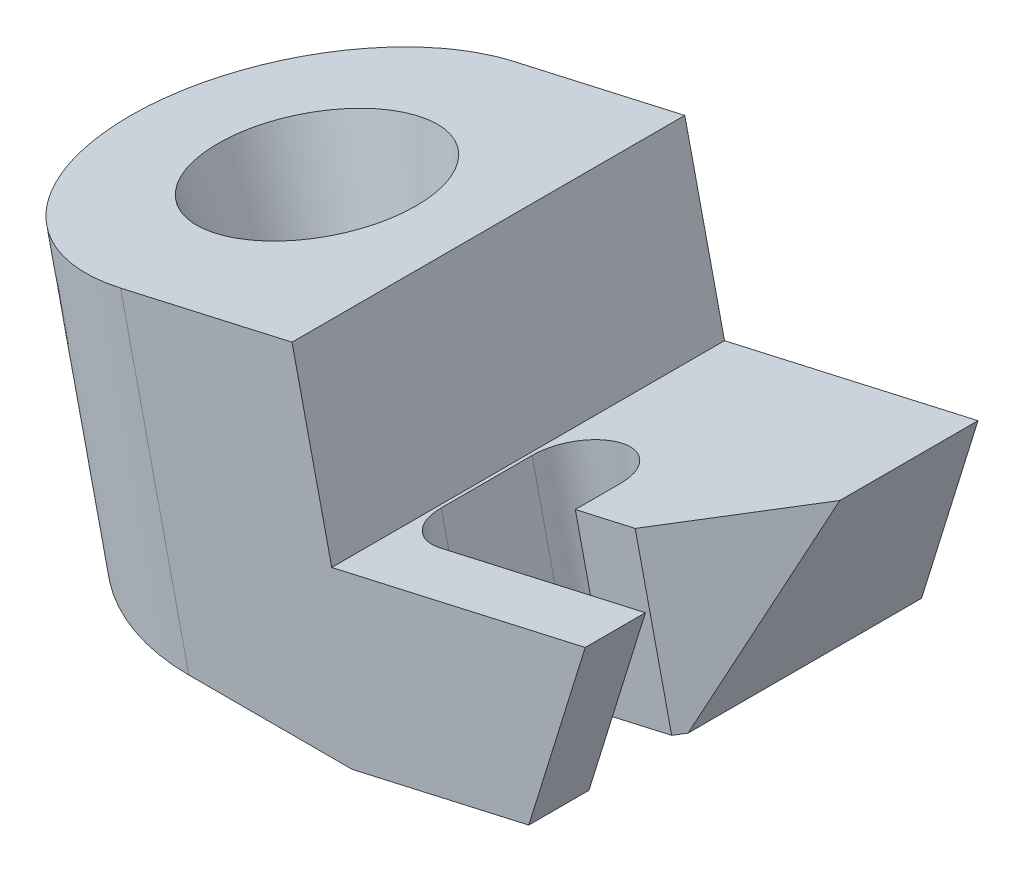
ISO-10303-21;
HEADER;
FILE_DESCRIPTION(('STEP AP214'),'2;1');
FILE_NAME('part.step','',(''),(''),'','','');
FILE_SCHEMA(('AUTOMOTIVE_DESIGN { 1 0 10303 214 1 1 1 1 }'));
ENDSEC;
DATA;
#1=APPLICATION_CONTEXT('core data for automotive mechanical design processes');
#2=APPLICATION_PROTOCOL_DEFINITION('international standard','automotive_design',2000,#1);
#3=PRODUCT_CONTEXT('',#1,'mechanical');
#4=PRODUCT('Part','Part','',(#3));
#5=PRODUCT_RELATED_PRODUCT_CATEGORY('part','',(#4));
#6=PRODUCT_DEFINITION_FORMATION('','',#4);
#7=PRODUCT_DEFINITION_CONTEXT('part definition',#1,'design');
#8=PRODUCT_DEFINITION('design','',#6,#7);
#9=PRODUCT_DEFINITION_SHAPE('','',#8);
#10=(LENGTH_UNIT() NAMED_UNIT(*) SI_UNIT(.MILLI.,.METRE.));
#11=(NAMED_UNIT(*) PLANE_ANGLE_UNIT() SI_UNIT($,.RADIAN.));
#12=(NAMED_UNIT(*) SI_UNIT($,.STERADIAN.) SOLID_ANGLE_UNIT());
#13=UNCERTAINTY_MEASURE_WITH_UNIT(LENGTH_MEASURE(1.E-05),#10,'distance_accuracy_value','');
#14=(GEOMETRIC_REPRESENTATION_CONTEXT(3) GLOBAL_UNCERTAINTY_ASSIGNED_CONTEXT((#13)) GLOBAL_UNIT_ASSIGNED_CONTEXT((#10,
#11,#12)) REPRESENTATION_CONTEXT('',''));
#15=CARTESIAN_POINT('',(0.,0.,0.));
#16=DIRECTION('',(0.,0.,1.));
#17=DIRECTION('',(1.,0.,0.));
#18=AXIS2_PLACEMENT_3D('',#15,#16,#17);
#19=CARTESIAN_POINT('',(-0.484477364538291,2.13726133435911,4.));
#20=DIRECTION('',(-0.221072685576457,0.975257334087785,0.));
#21=DIRECTION('',(-0.975257334087785,-0.221072685576457,0.));
#22=AXIS2_PLACEMENT_3D('',#19,#20,#21);
#23=PLANE('',#22);
#24=DIRECTION('',(0.689611074335385,0.156321995106234,-0.70710678118655));
#25=VECTOR('',#24,1.);
#26=CARTESIAN_POINT('',(-4.35365931639325,1.26018980135637,0.0326553652898135));
#27=LINE('',#26,#25);
#28=CARTESIAN_POINT('',(-4.5900076987712,1.20661402212594,0.275000000000022));
#29=VERTEX_POINT('',#28);
#30=CARTESIAN_POINT('',(-3.97817974770208,1.3453040309328,-0.352350269189598));
#31=VERTEX_POINT('',#30);
#32=EDGE_CURVE('E326',#29,#31,#27,.T.);
#33=ORIENTED_EDGE('',*,*,#32,.T.);
#34=DIRECTION('',(0.,0.,-1.));
#35=VECTOR('',#34,1.);
#36=CARTESIAN_POINT('',(-3.97817974770208,1.34530403093281,4.));
#37=LINE('',#36,#35);
#38=CARTESIAN_POINT('',(-3.97817974770208,1.3453040309328,-1.18958797837479));
#39=VERTEX_POINT('',#38);
#40=EDGE_CURVE('E331',#31,#39,#37,.T.);
#41=ORIENTED_EDGE('',*,*,#40,.T.);
#42=DIRECTION('',(-0.975257334087785,-0.221072685576457,0.));
#43=VECTOR('',#42,1.);
#44=CARTESIAN_POINT('',(-6.55185639975374,0.761899436691352,-1.18958797837479));
#45=LINE('',#44,#43);
#46=CARTESIAN_POINT('',(-5.51363645217724,0.997244574848627,-1.18958797837479));
#47=VERTEX_POINT('',#46);
#48=EDGE_CURVE('E188',#39,#47,#45,.T.);
#49=ORIENTED_EDGE('',*,*,#48,.T.);
#50=DIRECTION('',(0.,0.,-1.));
#51=VECTOR('',#50,1.);
#52=CARTESIAN_POINT('',(-5.51363645217724,0.997244574848627,4.));
#53=LINE('',#52,#51);
#54=CARTESIAN_POINT('',(-5.51363645217724,0.997244574848627,1.18958797837479));
#55=VERTEX_POINT('',#54);
#56=EDGE_CURVE('E179',#55,#47,#53,.T.);
#57=ORIENTED_EDGE('',*,*,#56,.F.);
#58=DIRECTION('',(0.975257334087785,0.221072685576457,0.));
#59=VECTOR('',#58,1.);
#60=CARTESIAN_POINT('',(-3.95609043161414,1.35031126775064,1.18958797837479));
#61=LINE('',#60,#59);
#62=CARTESIAN_POINT('',(-3.97817974770208,1.3453040309328,1.18958797837479));
#63=VERTEX_POINT('',#62);
#64=EDGE_CURVE('E308',#55,#63,#61,.T.);
#65=ORIENTED_EDGE('',*,*,#64,.T.);
#66=DIRECTION('',(0.,0.,-1.));
#67=VECTOR('',#66,1.);
#68=CARTESIAN_POINT('',(-3.97817974770208,1.34530403093281,4.));
#69=LINE('',#68,#67);
#70=CARTESIAN_POINT('',(-3.97817974770208,1.3453040309328,0.82500000000007));
#71=VERTEX_POINT('',#70);
#72=EDGE_CURVE('E165',#63,#71,#69,.T.);
#73=ORIENTED_EDGE('',*,*,#72,.T.);
#74=DIRECTION('',(0.975257334087785,0.221072685576457,0.));
#75=VECTOR('',#74,1.);
#76=CARTESIAN_POINT('',(-0.484477364538291,2.13726133435911,0.82500000000007));
#77=LINE('',#76,#75);
#78=CARTESIAN_POINT('',(-5.22105925195091,1.06356638052156,0.82500000000007));
#79=VERTEX_POINT('',#78);
#80=EDGE_CURVE('E156',#79,#71,#77,.T.);
#81=ORIENTED_EDGE('',*,*,#80,.F.);
#82=CARTESIAN_POINT('',(-5.22105925195091,1.06356638052156,0.550000000000047));
#83=DIRECTION('',(-0.221072685576457,0.975257334087785,0.));
#84=DIRECTION('',(-0.975257334087785,-0.221072685576457,0.));
#85=AXIS2_PLACEMENT_3D('',#82,#83,#84);
#86=CIRCLE('',#85,0.275000000000024);
#87=CARTESIAN_POINT('',(-5.48925501882508,1.00277139198803,0.550000000000047));
#88=VERTEX_POINT('',#87);
#89=EDGE_CURVE('E146',#88,#79,#86,.T.);
#90=ORIENTED_EDGE('',*,*,#89,.F.);
#91=DIRECTION('',(0.,0.,1.));
#92=VECTOR('',#91,1.);
#93=CARTESIAN_POINT('',(-5.48925501882507,1.00277139198803,4.));
#94=LINE('',#93,#92);
#95=CARTESIAN_POINT('',(-5.48925501882508,1.00277139198803,0.));
#96=VERTEX_POINT('',#95);
#97=EDGE_CURVE('E177',#96,#88,#94,.T.);
#98=ORIENTED_EDGE('',*,*,#97,.F.);
#99=CARTESIAN_POINT('',(-5.22105925195091,1.06356638052156,0.));
#100=DIRECTION('',(-0.221072685576457,0.975257334087785,0.));
#101=DIRECTION('',(-0.975257334087785,-0.221072685576457,0.));
#102=AXIS2_PLACEMENT_3D('',#99,#100,#101);
#103=CIRCLE('',#102,0.275000000000024);
#104=CARTESIAN_POINT('',(-4.95286348507675,1.12436136905509,0.));
#105=VERTEX_POINT('',#104);
#106=EDGE_CURVE('E175',#105,#96,#103,.T.);
#107=ORIENTED_EDGE('',*,*,#106,.F.);
#108=DIRECTION('',(0.,0.,1.));
#109=VECTOR('',#108,1.);
#110=CARTESIAN_POINT('',(-4.95286348507675,1.12436136905509,4.));
#111=LINE('',#110,#109);
#112=CARTESIAN_POINT('',(-4.95286348507675,1.12436136905509,0.275000000000024));
#113=VERTEX_POINT('',#112);
#114=EDGE_CURVE('E169',#105,#113,#111,.T.);
#115=ORIENTED_EDGE('',*,*,#114,.T.);
#116=DIRECTION('',(0.975257334087785,0.221072685576457,0.));
#117=VECTOR('',#116,1.);
#118=CARTESIAN_POINT('',(-0.484477364538308,2.1372613343591,0.275000000000003));
#119=LINE('',#118,#117);
#120=EDGE_CURVE('E166',#113,#29,#119,.T.);
#121=ORIENTED_EDGE('',*,*,#120,.T.);
#122=EDGE_LOOP('',(#33,#41,#49,#57,#65,#73,#81,#90,#98,#107,#115,#121));
#123=FACE_BOUND('',#122,.T.);
#124=ADVANCED_FACE('F35',(#123),#23,.T.);
#125=CARTESIAN_POINT('',(-0.263404678961834,1.16200400027132,4.));
#126=DIRECTION('',(0.221072685576457,-0.975257334087785,0.));
#127=DIRECTION('',(0.975257334087785,0.221072685576457,0.));
#128=AXIS2_PLACEMENT_3D('',#125,#126,#127);
#129=PLANE('',#128);
#130=DIRECTION('',(0.975257334087785,0.221072685576457,0.));
#131=VECTOR('',#130,1.);
#132=CARTESIAN_POINT('',(-6.33078371417728,-0.213357897396431,-1.18958797837479));
#133=LINE('',#132,#131);
#134=CARTESIAN_POINT('',(-5.38956,0.,-1.18958797837479));
#135=VERTEX_POINT('',#134);
#136=CARTESIAN_POINT('',(-4.32017214649036,0.242410322316982,-1.18958797837479));
#137=VERTEX_POINT('',#136);
#138=EDGE_CURVE('E190',#135,#137,#133,.T.);
#139=ORIENTED_EDGE('',*,*,#138,.T.);
#140=DIRECTION('',(0.,0.,1.));
#141=VECTOR('',#140,1.);
#142=CARTESIAN_POINT('',(-4.32017214649036,0.24241032231698,-0.374999999999985));
#143=LINE('',#142,#141);
#144=CARTESIAN_POINT('',(-4.32017214649036,0.24241032231698,0.225000000000026));
#145=VERTEX_POINT('',#144);
#146=EDGE_CURVE('E337',#137,#145,#143,.T.);
#147=ORIENTED_EDGE('',*,*,#146,.T.);
#148=DIRECTION('',(-0.689611074335384,-0.156321995106234,0.70710678118655));
#149=VECTOR('',#148,1.);
#150=CARTESIAN_POINT('',(-4.13258663081679,0.284932467268589,0.0326553652898135));
#151=LINE('',#150,#149);
#152=CARTESIAN_POINT('',(-4.36893501319474,0.231356688038159,0.275000000000022));
#153=VERTEX_POINT('',#152);
#154=EDGE_CURVE('E328',#145,#153,#151,.T.);
#155=ORIENTED_EDGE('',*,*,#154,.T.);
#156=DIRECTION('',(-0.975257334087785,-0.221072685576457,0.));
#157=VECTOR('',#156,1.);
#158=CARTESIAN_POINT('',(-0.263404678961851,1.16200400027132,0.275000000000003));
#159=LINE('',#158,#157);
#160=CARTESIAN_POINT('',(-4.73179079950029,0.149104034967309,0.275000000000024));
#161=VERTEX_POINT('',#160);
#162=EDGE_CURVE('E321',#153,#161,#159,.T.);
#163=ORIENTED_EDGE('',*,*,#162,.T.);
#164=DIRECTION('',(0.,0.,-1.));
#165=VECTOR('',#164,1.);
#166=CARTESIAN_POINT('',(-4.73179079950029,0.149104034967309,4.));
#167=LINE('',#166,#165);
#168=CARTESIAN_POINT('',(-4.73179079950029,0.149104034967309,0.));
#169=VERTEX_POINT('',#168);
#170=EDGE_CURVE('E318',#161,#169,#167,.T.);
#171=ORIENTED_EDGE('',*,*,#170,.T.);
#172=CARTESIAN_POINT('',(-4.99998656637446,0.0883090464337782,0.));
#173=DIRECTION('',(0.221072685576457,-0.975257334087785,0.));
#174=DIRECTION('',(0.975257334087785,0.221072685576457,0.));
#175=AXIS2_PLACEMENT_3D('',#172,#173,#174);
#176=CIRCLE('',#175,0.275000000000024);
#177=CARTESIAN_POINT('',(-5.26818233324862,0.0275140579002473,0.));
#178=VERTEX_POINT('',#177);
#179=EDGE_CURVE('E316',#178,#169,#176,.T.);
#180=ORIENTED_EDGE('',*,*,#179,.F.);
#181=DIRECTION('',(0.,0.,-1.));
#182=VECTOR('',#181,1.);
#183=CARTESIAN_POINT('',(-5.26818233324861,0.0275140579002481,4.));
#184=LINE('',#183,#182);
#185=CARTESIAN_POINT('',(-5.26818233324862,0.0275140579002473,0.550000000000047));
#186=VERTEX_POINT('',#185);
#187=EDGE_CURVE('E276',#186,#178,#184,.T.);
#188=ORIENTED_EDGE('',*,*,#187,.F.);
#189=CARTESIAN_POINT('',(-4.99998656637446,0.0883090464337782,0.550000000000047));
#190=DIRECTION('',(0.221072685576457,-0.975257334087785,0.));
#191=DIRECTION('',(0.975257334087785,0.221072685576457,0.));
#192=AXIS2_PLACEMENT_3D('',#189,#190,#191);
#193=CIRCLE('',#192,0.275000000000024);
#194=CARTESIAN_POINT('',(-4.99998656637446,0.0883090464337778,0.82500000000007));
#195=VERTEX_POINT('',#194);
#196=EDGE_CURVE('E312',#195,#186,#193,.T.);
#197=ORIENTED_EDGE('',*,*,#196,.F.);
#198=DIRECTION('',(-0.975257334087785,-0.221072685576457,0.));
#199=VECTOR('',#198,1.);
#200=CARTESIAN_POINT('',(-0.263404678961834,1.16200400027132,0.82500000000007));
#201=LINE('',#200,#199);
#202=CARTESIAN_POINT('',(-4.32017214649036,0.24241032231698,0.82500000000007));
#203=VERTEX_POINT('',#202);
#204=EDGE_CURVE('E160',#203,#195,#201,.T.);
#205=ORIENTED_EDGE('',*,*,#204,.F.);
#206=DIRECTION('',(0.,0.,1.));
#207=VECTOR('',#206,1.);
#208=CARTESIAN_POINT('',(-4.32017214649036,0.24241032231698,1.18958797837479));
#209=LINE('',#208,#207);
#210=CARTESIAN_POINT('',(-4.32017214649036,0.242410322316982,1.18958797837479));
#211=VERTEX_POINT('',#210);
#212=EDGE_CURVE('E335',#203,#211,#209,.T.);
#213=ORIENTED_EDGE('',*,*,#212,.T.);
#214=DIRECTION('',(-0.975257334087785,-0.221072685576457,0.));
#215=VECTOR('',#214,1.);
#216=CARTESIAN_POINT('',(-3.73501774603768,0.375053933662858,1.18958797837479));
#217=LINE('',#216,#215);
#218=CARTESIAN_POINT('',(-5.38956,0.,1.18958797837479));
#219=VERTEX_POINT('',#218);
#220=EDGE_CURVE('E310',#211,#219,#217,.T.);
#221=ORIENTED_EDGE('',*,*,#220,.T.);
#222=DIRECTION('',(0.,0.,-1.));
#223=VECTOR('',#222,1.);
#224=CARTESIAN_POINT('',(-5.38956,0.,4.));
#225=LINE('',#224,#223);
#226=EDGE_CURVE('E180',#219,#135,#225,.T.);
#227=ORIENTED_EDGE('',*,*,#226,.T.);
#228=EDGE_LOOP('',(#139,#147,#155,#163,#171,#180,#188,#197,#205,#213,#221,#227));
#229=FACE_BOUND('',#228,.T.);
#230=ADVANCED_FACE('F226',(#229),#129,.T.);
#231=CARTESIAN_POINT('',(-6.37914797837479,0.,0.));
#232=DIRECTION('',(0.,-1.,0.));
#233=DIRECTION('',(0.,0.,-1.));
#234=AXIS2_PLACEMENT_3D('',#231,#232,#233);
#235=PLANE('',#234);
#236=CARTESIAN_POINT('',(-6.37914797837479,0.,0.));
#237=DIRECTION('',(0.,1.,0.));
#238=DIRECTION('',(-1.,0.,0.));
#239=AXIS2_PLACEMENT_3D('',#236,#237,#238);
#240=ELLIPSE('',#239,0.528065754544373,0.515);
#241=CARTESIAN_POINT('',(-6.90721373291916,0.,0.));
#242=VERTEX_POINT('',#241);
#243=EDGE_CURVE('E282',#242,#242,#240,.F.);
#244=ORIENTED_EDGE('',*,*,#243,.F.);
#245=EDGE_LOOP('',(#244));
#246=FACE_BOUND('',#245,.T.);
#247=DIRECTION('',(-1.,0.,0.));
#248=VECTOR('',#247,1.);
#249=CARTESIAN_POINT('',(-6.37914797837479,0.,-1.18958797837479));
#250=LINE('',#249,#248);
#251=CARTESIAN_POINT('',(-6.37914797837479,0.,-1.18958797837479));
#252=VERTEX_POINT('',#251);
#253=EDGE_CURVE('E290',#135,#252,#250,.T.);
#254=ORIENTED_EDGE('',*,*,#253,.F.);
#255=ORIENTED_EDGE('',*,*,#226,.F.);
#256=DIRECTION('',(1.,0.,0.));
#257=VECTOR('',#256,1.);
#258=CARTESIAN_POINT('',(-3.65,0.,1.18958797837479));
#259=LINE('',#258,#257);
#260=CARTESIAN_POINT('',(-6.37914797837479,0.,1.18958797837479));
#261=VERTEX_POINT('',#260);
#262=EDGE_CURVE('E298',#261,#219,#259,.T.);
#263=ORIENTED_EDGE('',*,*,#262,.F.);
#264=CARTESIAN_POINT('',(-6.37914797837479,0.,0.));
#265=DIRECTION('',(0.,1.,0.));
#266=DIRECTION('',(0.,0.,-1.));
#267=AXIS2_PLACEMENT_3D('',#264,#265,#266);
#268=CIRCLE('',#267,1.18958797837479);
#269=EDGE_CURVE('E193',#252,#261,#268,.T.);
#270=ORIENTED_EDGE('',*,*,#269,.F.);
#271=EDGE_LOOP('',(#254,#255,#263,#270));
#272=FACE_BOUND('',#271,.T.);
#273=ADVANCED_FACE('F222',(#246,#272),#235,.T.);
#274=CARTESIAN_POINT('',(-7.84359145815428,6.46036049314671,-1.18958797837479));
#275=DIRECTION('',(0.,0.,1.));
#276=DIRECTION('',(1.,0.,0.));
#277=AXIS2_PLACEMENT_3D('',#274,#275,#276);
#278=PLANE('',#277);
#279=ORIENTED_EDGE('',*,*,#48,.F.);
#280=DIRECTION('',(-0.296174105251827,-0.955133969335339,0.));
#281=VECTOR('',#280,1.);
#282=CARTESIAN_POINT('',(-3.96476322018816,1.38857108551941,-1.18958797837479));
#283=LINE('',#282,#281);
#284=EDGE_CURVE('E333',#39,#137,#283,.T.);
#285=ORIENTED_EDGE('',*,*,#284,.T.);
#286=ORIENTED_EDGE('',*,*,#138,.F.);
#287=ORIENTED_EDGE('',*,*,#253,.T.);
#288=DIRECTION('',(0.221072685576457,-0.975257334087785,0.));
#289=VECTOR('',#288,1.);
#290=CARTESIAN_POINT('',(-7.84359145815428,6.46036049314671,-1.18958797837479));
#291=LINE('',#290,#289);
#292=CARTESIAN_POINT('',(-6.79247833825339,1.82339787396911,-1.18958797837479));
#293=VERTEX_POINT('',#292);
#294=EDGE_CURVE('E297',#293,#252,#291,.T.);
#295=ORIENTED_EDGE('',*,*,#294,.F.);
#296=DIRECTION('',(0.975257334087785,0.221072685576457,0.));
#297=VECTOR('',#296,1.);
#298=CARTESIAN_POINT('',(-6.79247833825339,1.82339787396911,-1.18958797837479));
#299=LINE('',#298,#297);
#300=CARTESIAN_POINT('',(-5.75425839067689,2.05874301212638,-1.18958797837479));
#301=VERTEX_POINT('',#300);
#302=EDGE_CURVE('E197',#293,#301,#299,.T.);
#303=ORIENTED_EDGE('',*,*,#302,.T.);
#304=DIRECTION('',(-0.221072685576457,0.975257334087785,0.));
#305=VECTOR('',#304,1.);
#306=CARTESIAN_POINT('',(-6.80537151057778,6.69570563130399,-1.18958797837479));
#307=LINE('',#306,#305);
#308=EDGE_CURVE('E186',#47,#301,#307,.T.);
#309=ORIENTED_EDGE('',*,*,#308,.F.);
#310=EDGE_LOOP('',(#279,#285,#286,#287,#295,#303,#309));
#311=FACE_BOUND('',#310,.T.);
#312=ADVANCED_FACE('F225',(#311),#278,.F.);
#313=CARTESIAN_POINT('',(-5.11444347977949,6.46036049314671,1.18958797837479));
#314=DIRECTION('',(0.,0.,-1.));
#315=DIRECTION('',(-1.,0.,0.));
#316=AXIS2_PLACEMENT_3D('',#313,#314,#315);
#317=PLANE('',#316);
#318=ORIENTED_EDGE('',*,*,#220,.F.);
#319=DIRECTION('',(0.296174105251828,0.955133969335339,0.));
#320=VECTOR('',#319,1.);
#321=CARTESIAN_POINT('',(-3.96476322018816,1.38857108551941,1.18958797837479));
#322=LINE('',#321,#320);
#323=EDGE_CURVE('E51',#211,#63,#322,.T.);
#324=ORIENTED_EDGE('',*,*,#323,.T.);
#325=ORIENTED_EDGE('',*,*,#64,.F.);
#326=DIRECTION('',(0.221072685576457,-0.975257334087785,0.));
#327=VECTOR('',#326,1.);
#328=CARTESIAN_POINT('',(-6.6719895003426,6.1072938002447,1.18958797837479));
#329=LINE('',#328,#327);
#330=CARTESIAN_POINT('',(-5.75425839067689,2.05874301212638,1.18958797837479));
#331=VERTEX_POINT('',#330);
#332=EDGE_CURVE('E182',#331,#55,#329,.T.);
#333=ORIENTED_EDGE('',*,*,#332,.F.);
#334=DIRECTION('',(-0.975257334087785,-0.221072685576457,0.));
#335=VECTOR('',#334,1.);
#336=CARTESIAN_POINT('',(-4.19671237011379,2.41180970502839,1.18958797837479));
#337=LINE('',#336,#335);
#338=CARTESIAN_POINT('',(-6.79247833825339,1.82339787396911,1.18958797837479));
#339=VERTEX_POINT('',#338);
#340=EDGE_CURVE('E194',#331,#339,#337,.T.);
#341=ORIENTED_EDGE('',*,*,#340,.T.);
#342=DIRECTION('',(0.221072685576457,-0.975257334087785,0.));
#343=VECTOR('',#342,1.);
#344=CARTESIAN_POINT('',(-7.84359145815428,6.46036049314671,1.18958797837479));
#345=LINE('',#344,#343);
#346=EDGE_CURVE('E300',#339,#261,#345,.T.);
#347=ORIENTED_EDGE('',*,*,#346,.T.);
#348=ORIENTED_EDGE('',*,*,#262,.T.);
#349=EDGE_LOOP('',(#318,#324,#325,#333,#341,#347,#348));
#350=FACE_BOUND('',#349,.T.);
#351=ADVANCED_FACE('F218',(#350),#317,.F.);
#352=CARTESIAN_POINT('',(-0.725099303037942,3.19875977163686,0.));
#353=DIRECTION('',(0.221072685576457,-0.975257334087785,0.));
#354=DIRECTION('',(0.975257334087785,0.221072685576457,0.));
#355=AXIS2_PLACEMENT_3D('',#352,#353,#354);
#356=PLANE('',#355);
#357=CARTESIAN_POINT('',(-6.79247833825339,1.82339787396911,0.));
#358=DIRECTION('',(0.221072685576457,-0.975257334087785,0.));
#359=DIRECTION('',(0.975257334087785,0.221072685576457,0.));
#360=AXIS2_PLACEMENT_3D('',#357,#358,#359);
#361=CIRCLE('',#360,0.614999999999991);
#362=CARTESIAN_POINT('',(-6.19269507778941,1.95935757559863,0.));
#363=VERTEX_POINT('',#362);
#364=EDGE_CURVE('E11',#363,#363,#361,.T.);
#365=ORIENTED_EDGE('',*,*,#364,.T.);
#366=EDGE_LOOP('',(#365));
#367=FACE_BOUND('',#366,.T.);
#368=DIRECTION('',(0.,0.,1.));
#369=VECTOR('',#368,1.);
#370=CARTESIAN_POINT('',(-5.75425839067689,2.05874301212638,0.));
#371=LINE('',#370,#369);
#372=EDGE_CURVE('E206',#301,#331,#371,.T.);
#373=ORIENTED_EDGE('',*,*,#372,.F.);
#374=ORIENTED_EDGE('',*,*,#302,.F.);
#375=CARTESIAN_POINT('',(-6.79247833825339,1.82339787396911,1.18958797837479));
#376=CARTESIAN_POINT('',(-6.82325520958241,1.81642133007599,1.18958817164655));
#377=CARTESIAN_POINT('',(-6.8540175806747,1.80944807311665,1.1882668584563));
#378=CARTESIAN_POINT('',(-6.91532512901443,1.79555079300007,1.18299784578291));
#379=CARTESIAN_POINT('',(-6.94587032371153,1.78862676588731,1.17905035977327));
#380=CARTESIAN_POINT('',(-7.03676687753513,1.76802220895545,1.16331723466811));
#381=CARTESIAN_POINT('',(-7.09652140203759,1.75447697043698,1.14764075136729));
#382=CARTESIAN_POINT('',(-7.21265079871787,1.72815259767797,1.10640099611687));
#383=CARTESIAN_POINT('',(-7.26902583433562,1.71537342638863,1.08083820273847));
#384=CARTESIAN_POINT('',(-7.37693988833668,1.69091131890624,1.0206076307669));
#385=CARTESIAN_POINT('',(-7.42847922974977,1.67922830948835,0.985940460944829));
#386=CARTESIAN_POINT('',(-7.52540171150277,1.65725778685294,0.908523187431413));
#387=CARTESIAN_POINT('',(-7.57078532540016,1.64697016628876,0.865773706115213));
#388=CARTESIAN_POINT('',(-7.65484797163215,1.62791472901142,0.77279776022093));
#389=CARTESIAN_POINT('',(-7.6934320792674,1.61916842996082,0.722481242588426));
#390=CARTESIAN_POINT('',(-7.76226720648293,1.60356478782004,0.616138138279092));
#391=CARTESIAN_POINT('',(-7.79251667852757,1.59670779552738,0.560110493829405));
#392=CARTESIAN_POINT('',(-7.83155001652516,1.58785966431531,0.471959574261713));
#393=CARTESIAN_POINT('',(-7.84365123894135,1.5851165424292,0.441336385506919));
#394=CARTESIAN_POINT('',(-7.86536277976728,1.58019494023233,0.379207420363207));
#395=CARTESIAN_POINT('',(-7.87497536750083,1.57801594550811,0.347702477286206));
#396=CARTESIAN_POINT('',(-7.90000593830471,1.57234198099029,0.252122490622416));
#397=CARTESIAN_POINT('',(-7.91162817041476,1.56970743729086,0.186956344309783));
#398=CARTESIAN_POINT('',(-7.92443699957528,1.56680391412569,0.0555894184860891));
#399=CARTESIAN_POINT('',(-7.92562381405633,1.56653488537249,-0.0106113394391897));
#400=CARTESIAN_POINT('',(-7.91754948532795,1.56836518541105,-0.142349151425338));
#401=CARTESIAN_POINT('',(-7.90828828028349,1.57046452821966,-0.207886201555838));
#402=CARTESIAN_POINT('',(-7.87952044917038,1.57698566008927,-0.336555331952412));
#403=CARTESIAN_POINT('',(-7.86001349282922,1.5814075240169,-0.399687334621254));
#404=CARTESIAN_POINT('',(-7.81119987660467,1.59247266226737,-0.521844487759324));
#405=CARTESIAN_POINT('',(-7.78189266707724,1.59911606118427,-0.580869407659788));
#406=CARTESIAN_POINT('',(-7.71428544337162,1.61444136045305,-0.692973357924859));
#407=CARTESIAN_POINT('',(-7.67601492345095,1.62311657500571,-0.74607106359068));
#408=CARTESIAN_POINT('',(-7.59190409108753,1.64218293518238,-0.844387815855783));
#409=CARTESIAN_POINT('',(-7.546162624685,1.65255167424885,-0.88969569637779));
#410=CARTESIAN_POINT('',(-7.44854120371491,1.67468063339565,-0.971380031392993));
#411=CARTESIAN_POINT('',(-7.39674141147042,1.68642268216937,-1.00785704509558));
#412=CARTESIAN_POINT('',(-7.28852043171575,1.71095436400744,-1.07113097309615));
#413=CARTESIAN_POINT('',(-7.23215318320808,1.72373177010385,-1.09802504347104));
#414=CARTESIAN_POINT('',(-7.11317661576728,1.75070154348106,-1.14281731781077));
#415=CARTESIAN_POINT('',(-7.05040061667397,1.76493169405181,-1.16025692234172));
#416=CARTESIAN_POINT('',(-6.95464961077816,1.78663666491454,-1.17780405257571));
#417=CARTESIAN_POINT('',(-6.92237271963376,1.79395323538055,-1.18221788177246));
#418=CARTESIAN_POINT('',(-6.85756251490802,1.80864450250635,-1.18811000462268));
#419=CARTESIAN_POINT('',(-6.82502918121363,1.81601920372539,-1.18958806567383));
#420=CARTESIAN_POINT('',(-6.79247833825339,1.82339787396911,-1.18958797837479));
#421=B_SPLINE_CURVE_WITH_KNOTS('',3,(#375,#376,#377,#378,#379,#380,#381,#382,#383,#384,#385,
#386,#387,#388,#389,#390,#391,#392,#393,#394,#395,#396,#397,#398,#399,#400,#401,#402,#403,#404,
#405,#406,#407,#408,#409,#410,#411,#412,#413,#414,#415,#416,#417,#418,#419,#420),.UNSPECIFIED.,
.F.,.F.,(4,2,2,2,2,2,2,2,2,2,2,2,2,2,2,2,2,2,2,2,2,2,4),(0.,0.0946159948154047,
0.189224299527521,0.378008961944753,0.566784486918873,0.755547392485525,0.944295768356561,
1.1355001545406,1.32674001876177,1.42576781372737,1.52470498710553,1.72249493042711,
1.92028075262151,2.11806774538731,2.31586111422158,2.51366557809391,2.71082808030311,
2.90556669656329,3.09797077222197,3.28836460460028,3.48731489989104,3.58736876285008,
3.68743055280842),.UNSPECIFIED.);
#422=EDGE_CURVE('E196',#339,#293,#421,.T.);
#423=ORIENTED_EDGE('',*,*,#422,.F.);
#424=ORIENTED_EDGE('',*,*,#340,.F.);
#425=EDGE_LOOP('',(#373,#374,#423,#424));
#426=FACE_BOUND('',#425,.T.);
#427=ADVANCED_FACE('F213',(#367,#426),#356,.F.);
#428=CARTESIAN_POINT('',(-7.84359145815428,6.46036049314671,0.));
#429=DIRECTION('',(0.,1.,0.));
#430=DIRECTION('',(0.,0.,-1.));
#431=AXIS2_PLACEMENT_3D('',#428,#429,#430);
#432=CIRCLE('',#431,1.18958797837479);
#433=DIRECTION('',(0.221072685576457,-0.975257334087785,0.));
#434=VECTOR('',#433,1.);
#435=SURFACE_OF_LINEAR_EXTRUSION('',#432,#434);
#436=ORIENTED_EDGE('',*,*,#346,.F.);
#437=ORIENTED_EDGE('',*,*,#422,.T.);
#438=ORIENTED_EDGE('',*,*,#294,.T.);
#439=ORIENTED_EDGE('',*,*,#269,.T.);
#440=EDGE_LOOP('',(#436,#437,#438,#439));
#441=FACE_BOUND('',#440,.T.);
#442=ADVANCED_FACE('F209',(#441),#435,.F.);
#443=CARTESIAN_POINT('',(-5.02915908763895,-1.14001675951048,4.));
#444=DIRECTION('',(0.975257334087785,0.221072685576457,0.));
#445=DIRECTION('',(-0.221072685576457,0.975257334087785,0.));
#446=AXIS2_PLACEMENT_3D('',#443,#444,#445);
#447=PLANE('',#446);
#448=ORIENTED_EDGE('',*,*,#308,.T.);
#449=ORIENTED_EDGE('',*,*,#372,.T.);
#450=ORIENTED_EDGE('',*,*,#332,.T.);
#451=ORIENTED_EDGE('',*,*,#56,.T.);
#452=EDGE_LOOP('',(#448,#449,#450,#451));
#453=FACE_BOUND('',#452,.T.);
#454=ADVANCED_FACE('F220',(#453),#447,.T.);
#455=CARTESIAN_POINT('',(-4.79300399908265,-2.06872480664597,0.));
#456=DIRECTION('',(-0.975257334087785,-0.221072685576457,0.));
#457=DIRECTION('',(0.221072685576457,-0.975257334087785,0.));
#458=AXIS2_PLACEMENT_3D('',#455,#456,#457);
#459=PLANE('',#458);
#460=ORIENTED_EDGE('',*,*,#97,.T.);
#461=DIRECTION('',(-0.221072685576457,0.975257334087785,0.));
#462=VECTOR('',#461,1.);
#463=CARTESIAN_POINT('',(-4.79300399908265,-2.06872480664597,0.550000000000047));
#464=LINE('',#463,#462);
#465=EDGE_CURVE('E152',#186,#88,#464,.T.);
#466=ORIENTED_EDGE('',*,*,#465,.F.);
#467=ORIENTED_EDGE('',*,*,#187,.T.);
#468=DIRECTION('',(-0.221072685576457,0.975257334087785,0.));
#469=VECTOR('',#468,1.);
#470=CARTESIAN_POINT('',(-4.79300399908265,-2.06872480664597,0.));
#471=LINE('',#470,#469);
#472=EDGE_CURVE('E157',#178,#96,#471,.T.);
#473=ORIENTED_EDGE('',*,*,#472,.T.);
#474=EDGE_LOOP('',(#460,#466,#467,#473));
#475=FACE_BOUND('',#474,.T.);
#476=ADVANCED_FACE('F247',(#475),#459,.F.);
#477=CARTESIAN_POINT('',(-4.52480823220849,-2.00792981811244,0.));
#478=DIRECTION('',(-0.221072685576457,0.975257334087785,0.));
#479=DIRECTION('',(-0.975257334087785,-0.221072685576457,0.));
#480=AXIS2_PLACEMENT_3D('',#477,#478,#479);
#481=CYLINDRICAL_SURFACE('',#480,0.275000000000024);
#482=ORIENTED_EDGE('',*,*,#106,.T.);
#483=ORIENTED_EDGE('',*,*,#472,.F.);
#484=ORIENTED_EDGE('',*,*,#179,.T.);
#485=DIRECTION('',(-0.221072685576457,0.975257334087785,0.));
#486=VECTOR('',#485,1.);
#487=CARTESIAN_POINT('',(-4.25661246533433,-1.94713482957891,0.));
#488=LINE('',#487,#486);
#489=EDGE_CURVE('E274',#169,#105,#488,.T.);
#490=ORIENTED_EDGE('',*,*,#489,.T.);
#491=EDGE_LOOP('',(#482,#483,#484,#490));
#492=FACE_BOUND('',#491,.T.);
#493=ADVANCED_FACE('F250',(#492),#481,.F.);
#494=CARTESIAN_POINT('',(-4.25661246533433,-1.94713482957891,0.));
#495=DIRECTION('',(-0.975257334087785,-0.221072685576457,0.));
#496=DIRECTION('',(0.221072685576457,-0.975257334087785,0.));
#497=AXIS2_PLACEMENT_3D('',#494,#495,#496);
#498=PLANE('',#497);
#499=ORIENTED_EDGE('',*,*,#489,.F.);
#500=ORIENTED_EDGE('',*,*,#170,.F.);
#501=DIRECTION('',(-0.221072685576457,0.975257334087785,0.));
#502=VECTOR('',#501,1.);
#503=CARTESIAN_POINT('',(-4.25661246533433,-1.94713482957891,0.275000000000024));
#504=LINE('',#503,#502);
#505=EDGE_CURVE('E161',#161,#113,#504,.T.);
#506=ORIENTED_EDGE('',*,*,#505,.T.);
#507=ORIENTED_EDGE('',*,*,#114,.F.);
#508=EDGE_LOOP('',(#499,#500,#506,#507));
#509=FACE_BOUND('',#508,.T.);
#510=ADVANCED_FACE('F259',(#509),#498,.T.);
#511=CARTESIAN_POINT('',(0.211773655204133,-0.934234864274893,0.275000000000003));
#512=DIRECTION('',(0.,0.,1.));
#513=DIRECTION('',(1.,0.,0.));
#514=AXIS2_PLACEMENT_3D('',#511,#512,#513);
#515=PLANE('',#514);
#516=ORIENTED_EDGE('',*,*,#162,.F.);
#517=DIRECTION('',(-0.221072685576457,0.975257334087785,0.));
#518=VECTOR('',#517,1.);
#519=CARTESIAN_POINT('',(-4.5900076987712,1.20661402212594,0.275000000000022));
#520=LINE('',#519,#518);
#521=EDGE_CURVE('E323',#153,#29,#520,.T.);
#522=ORIENTED_EDGE('',*,*,#521,.T.);
#523=ORIENTED_EDGE('',*,*,#120,.F.);
#524=ORIENTED_EDGE('',*,*,#505,.F.);
#525=EDGE_LOOP('',(#516,#522,#523,#524));
#526=FACE_BOUND('',#525,.T.);
#527=ADVANCED_FACE('F256',(#526),#515,.T.);
#528=CARTESIAN_POINT('',(0.211773655204131,-0.934234864274893,0.825000000000071));
#529=DIRECTION('',(0.,0.,1.));
#530=DIRECTION('',(1.,0.,0.));
#531=AXIS2_PLACEMENT_3D('',#528,#529,#530);
#532=PLANE('',#531);
#533=ORIENTED_EDGE('',*,*,#80,.T.);
#534=DIRECTION('',(-0.296174105251828,-0.955133969335339,0.));
#535=VECTOR('',#534,1.);
#536=CARTESIAN_POINT('',(-3.96476322018816,1.38857108551941,0.82500000000007));
#537=LINE('',#536,#535);
#538=EDGE_CURVE('E59',#71,#203,#537,.T.);
#539=ORIENTED_EDGE('',*,*,#538,.T.);
#540=ORIENTED_EDGE('',*,*,#204,.T.);
#541=DIRECTION('',(-0.221072685576457,0.975257334087785,0.));
#542=VECTOR('',#541,1.);
#543=CARTESIAN_POINT('',(-4.52480823220849,-2.00792981811244,0.82500000000007));
#544=LINE('',#543,#542);
#545=EDGE_CURVE('E149',#195,#79,#544,.T.);
#546=ORIENTED_EDGE('',*,*,#545,.T.);
#547=EDGE_LOOP('',(#533,#539,#540,#546));
#548=FACE_BOUND('',#547,.T.);
#549=ADVANCED_FACE('F159',(#548),#532,.F.);
#550=CARTESIAN_POINT('',(-4.52480823220849,-2.00792981811244,0.550000000000047));
#551=DIRECTION('',(-0.221072685576457,0.975257334087785,0.));
#552=DIRECTION('',(-0.975257334087785,-0.221072685576457,0.));
#553=AXIS2_PLACEMENT_3D('',#550,#551,#552);
#554=CYLINDRICAL_SURFACE('',#553,0.275000000000024);
#555=ORIENTED_EDGE('',*,*,#89,.T.);
#556=ORIENTED_EDGE('',*,*,#545,.F.);
#557=ORIENTED_EDGE('',*,*,#196,.T.);
#558=ORIENTED_EDGE('',*,*,#465,.T.);
#559=EDGE_LOOP('',(#555,#556,#557,#558));
#560=FACE_BOUND('',#559,.T.);
#561=ADVANCED_FACE('F148',(#560),#554,.F.);
#562=CARTESIAN_POINT('',(-5.85560538001132,-2.30959676194265,0.));
#563=DIRECTION('',(-0.221072685576457,0.975257334087785,0.));
#564=DIRECTION('',(-0.975257334087785,-0.221072685576457,0.));
#565=AXIS2_PLACEMENT_3D('',#562,#563,#564);
#566=CYLINDRICAL_SURFACE('',#565,0.515);
#567=CARTESIAN_POINT('',(-6.66710178800102,1.27030195514306,0.));
#568=DIRECTION('',(0.221072685576457,-0.975257334087785,0.));
#569=DIRECTION('',(0.975257334087785,0.221072685576457,0.));
#570=AXIS2_PLACEMENT_3D('',#567,#568,#569);
#571=CIRCLE('',#570,0.515);
#572=CARTESIAN_POINT('',(-6.16484426094581,1.38415438821494,0.));
#573=VERTEX_POINT('',#572);
#574=EDGE_CURVE('E44',#573,#573,#571,.F.);
#575=ORIENTED_EDGE('',*,*,#574,.T.);
#576=EDGE_LOOP('',(#575));
#577=FACE_BOUND('',#576,.T.);
#578=ORIENTED_EDGE('',*,*,#243,.T.);
#579=EDGE_LOOP('',(#578));
#580=FACE_BOUND('',#579,.T.);
#581=ADVANCED_FACE('F242',(#577,#580),#566,.F.);
#582=CARTESIAN_POINT('',(-3.89375667902878,-1.86488217650806,0.275000000000022));
#583=DIRECTION('',(0.689611074335389,0.156321995106235,0.707106781186545));
#584=DIRECTION('',(0.221072685576457,-0.975257334087785,0.));
#585=AXIS2_PLACEMENT_3D('',#582,#583,#584);
#586=PLANE('',#585);
#587=ORIENTED_EDGE('',*,*,#154,.F.);
#588=DIRECTION('',(0.264906173007305,0.854297793221207,-0.447213595499958));
#589=VECTOR('',#588,1.);
#590=CARTESIAN_POINT('',(-4.77307055383976,-1.21814495867044,0.989581371764973));
#591=LINE('',#590,#589);
#592=EDGE_CURVE('E340',#145,#31,#591,.T.);
#593=ORIENTED_EDGE('',*,*,#592,.T.);
#594=ORIENTED_EDGE('',*,*,#32,.F.);
#595=ORIENTED_EDGE('',*,*,#521,.F.);
#596=EDGE_LOOP('',(#587,#593,#594,#595));
#597=FACE_BOUND('',#596,.T.);
#598=ADVANCED_FACE('F245',(#597),#586,.T.);
#599=CARTESIAN_POINT('',(-3.96476322018816,1.38857108551941,-1.18958797837479));
#600=DIRECTION('',(0.955133969335339,-0.296174105251827,0.));
#601=DIRECTION('',(0.,0.,1.));
#602=AXIS2_PLACEMENT_3D('',#599,#600,#601);
#603=PLANE('',#602);
#604=ORIENTED_EDGE('',*,*,#592,.F.);
#605=ORIENTED_EDGE('',*,*,#146,.F.);
#606=ORIENTED_EDGE('',*,*,#284,.F.);
#607=ORIENTED_EDGE('',*,*,#40,.F.);
#608=EDGE_LOOP('',(#604,#605,#606,#607));
#609=FACE_BOUND('',#608,.T.);
#610=ADVANCED_FACE('F352',(#609),#603,.T.);
#611=CARTESIAN_POINT('',(-3.96476322018816,1.38857108551941,-1.18958797837479));
#612=DIRECTION('',(0.955133969335338,-0.296174105251828,0.));
#613=DIRECTION('',(0.,0.,1.));
#614=AXIS2_PLACEMENT_3D('',#611,#612,#613);
#615=PLANE('',#614);
#616=ORIENTED_EDGE('',*,*,#323,.F.);
#617=ORIENTED_EDGE('',*,*,#212,.F.);
#618=ORIENTED_EDGE('',*,*,#538,.F.);
#619=ORIENTED_EDGE('',*,*,#72,.F.);
#620=EDGE_LOOP('',(#616,#617,#618,#619));
#621=FACE_BOUND('',#620,.T.);
#622=ADVANCED_FACE('F347',(#621),#615,.T.);
#623=CARTESIAN_POINT('',(-6.66710178800102,1.27030195514306,0.));
#624=DIRECTION('',(-0.221072685576457,0.975257334087785,0.));
#625=DIRECTION('',(-0.975257334087785,-0.221072685576457,0.));
#626=AXIS2_PLACEMENT_3D('',#623,#624,#625);
#627=CONICAL_SURFACE('',#626,0.515,0.174532925199431);
#628=ORIENTED_EDGE('',*,*,#364,.F.);
#629=EDGE_LOOP('',(#628));
#630=FACE_BOUND('',#629,.T.);
#631=ORIENTED_EDGE('',*,*,#574,.F.);
#632=EDGE_LOOP('',(#631));
#633=FACE_BOUND('',#632,.T.);
#634=ADVANCED_FACE('F38',(#630,#633),#627,.F.);
#635=CLOSED_SHELL('',(#124,#230,#273,#312,#351,#427,#442,#454,#476,#493,#510,#527,#549,#561,
#581,#598,#610,#622,#634));
#636=MANIFOLD_SOLID_BREP('B2',#635);
#637=ADVANCED_BREP_SHAPE_REPRESENTATION('',(#18,#636),#14);
#638=SHAPE_DEFINITION_REPRESENTATION(#9,#637);
ENDSEC;
END-ISO-10303-21;
